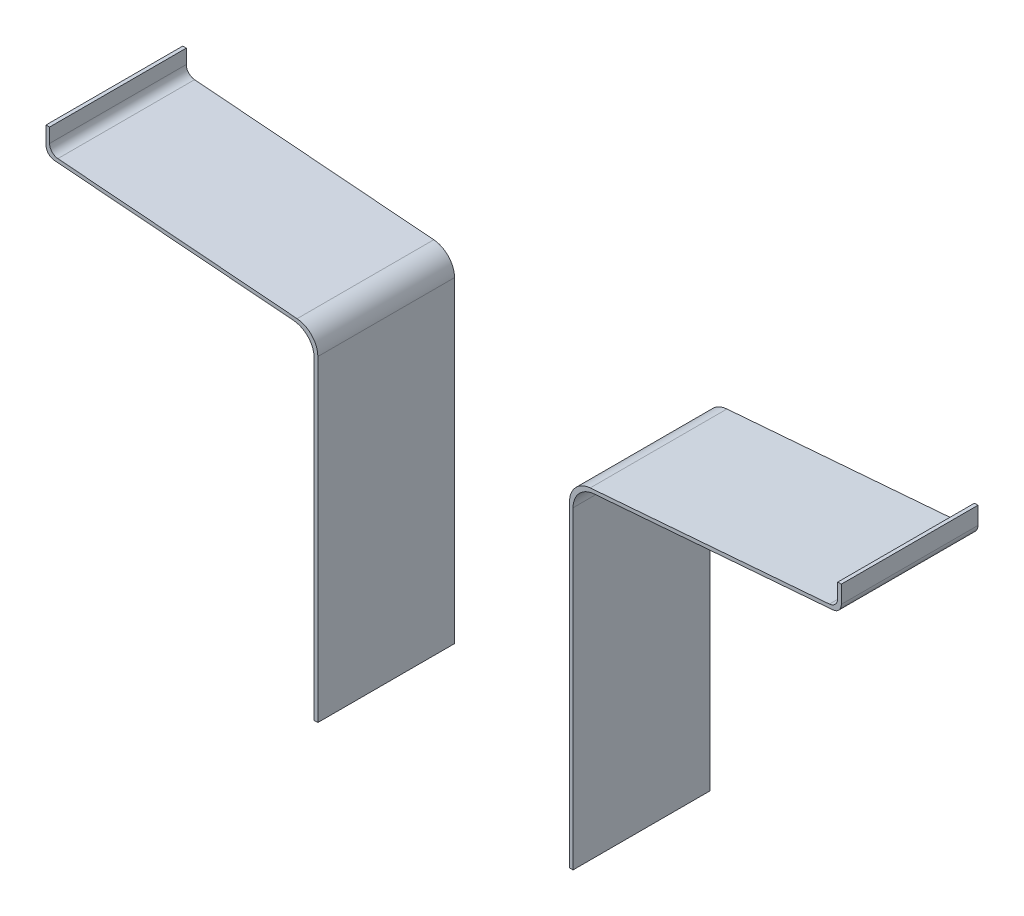
ISO-10303-21;
HEADER;
FILE_DESCRIPTION(('STEP AP214'),'2;1');
FILE_NAME('part.step','',(''),(''),'','','');
FILE_SCHEMA(('AUTOMOTIVE_DESIGN { 1 0 10303 214 1 1 1 1 }'));
ENDSEC;
DATA;
#1=APPLICATION_CONTEXT('core data for automotive mechanical design processes');
#2=APPLICATION_PROTOCOL_DEFINITION('international standard','automotive_design',2000,#1);
#3=PRODUCT_CONTEXT('',#1,'mechanical');
#4=PRODUCT('Part','Part','',(#3));
#5=PRODUCT_RELATED_PRODUCT_CATEGORY('part','',(#4));
#6=PRODUCT_DEFINITION_FORMATION('','',#4);
#7=PRODUCT_DEFINITION_CONTEXT('part definition',#1,'design');
#8=PRODUCT_DEFINITION('design','',#6,#7);
#9=PRODUCT_DEFINITION_SHAPE('','',#8);
#10=(LENGTH_UNIT() NAMED_UNIT(*) SI_UNIT(.MILLI.,.METRE.));
#11=(NAMED_UNIT(*) PLANE_ANGLE_UNIT() SI_UNIT($,.RADIAN.));
#12=(NAMED_UNIT(*) SI_UNIT($,.STERADIAN.) SOLID_ANGLE_UNIT());
#13=UNCERTAINTY_MEASURE_WITH_UNIT(LENGTH_MEASURE(1.E-05),#10,'distance_accuracy_value','');
#14=(GEOMETRIC_REPRESENTATION_CONTEXT(3) GLOBAL_UNCERTAINTY_ASSIGNED_CONTEXT((#13)) GLOBAL_UNIT_ASSIGNED_CONTEXT((#10,
#11,#12)) REPRESENTATION_CONTEXT('',''));
#15=CARTESIAN_POINT('',(0.,0.,0.));
#16=DIRECTION('',(0.,0.,1.));
#17=DIRECTION('',(1.,0.,0.));
#18=AXIS2_PLACEMENT_3D('',#15,#16,#17);
#19=CARTESIAN_POINT('',(350.,0.,60.7));
#20=DIRECTION('',(1.,0.,0.));
#21=DIRECTION('',(0.,0.,-1.));
#22=AXIS2_PLACEMENT_3D('',#19,#20,#21);
#23=PLANE('',#22);
#24=DIRECTION('',(0.,-1.,0.));
#25=VECTOR('',#24,1.);
#26=CARTESIAN_POINT('',(350.,0.,0.));
#27=LINE('',#26,#25);
#28=CARTESIAN_POINT('',(350.,0.,0.));
#29=VERTEX_POINT('',#28);
#30=CARTESIAN_POINT('',(350.,-6.30534185427882,0.));
#31=VERTEX_POINT('',#30);
#32=EDGE_CURVE('E171',#29,#31,#27,.T.);
#33=ORIENTED_EDGE('',*,*,#32,.T.);
#34=DIRECTION('',(0.,0.,-1.));
#35=VECTOR('',#34,1.);
#36=CARTESIAN_POINT('',(350.,-6.30534185427882,60.7));
#37=LINE('',#36,#35);
#38=CARTESIAN_POINT('',(350.,-6.30534185427882,60.7));
#39=VERTEX_POINT('',#38);
#40=EDGE_CURVE('E215',#31,#39,#37,.F.);
#41=ORIENTED_EDGE('',*,*,#40,.T.);
#42=DIRECTION('',(0.,-1.,0.));
#43=VECTOR('',#42,1.);
#44=CARTESIAN_POINT('',(350.,0.,60.7));
#45=LINE('',#44,#43);
#46=CARTESIAN_POINT('',(350.,0.,60.7));
#47=VERTEX_POINT('',#46);
#48=EDGE_CURVE('E188',#47,#39,#45,.T.);
#49=ORIENTED_EDGE('',*,*,#48,.F.);
#50=DIRECTION('',(0.,0.,-1.));
#51=VECTOR('',#50,1.);
#52=CARTESIAN_POINT('',(350.,0.,60.7));
#53=LINE('',#52,#51);
#54=EDGE_CURVE('E170',#47,#29,#53,.T.);
#55=ORIENTED_EDGE('',*,*,#54,.T.);
#56=EDGE_LOOP('',(#33,#41,#49,#55));
#57=FACE_BOUND('',#56,.T.);
#58=ADVANCED_FACE('F43',(#57),#23,.F.);
#59=CARTESIAN_POINT('',(350.,-10.,60.7));
#60=DIRECTION('',(0.0792398536366962,-0.99685557910644,0.));
#61=DIRECTION('',(0.99685557910644,0.0792398536366962,0.));
#62=AXIS2_PLACEMENT_3D('',#59,#60,#61);
#63=PLANE('',#62);
#64=DIRECTION('',(-0.99685557910644,-0.0792398536366962,0.));
#65=VECTOR('',#64,1.);
#66=CARTESIAN_POINT('',(350.,-10.,60.7));
#67=LINE('',#66,#65);
#68=CARTESIAN_POINT('',(346.316959414547,-10.2927641707046,60.7));
#69=VERTEX_POINT('',#68);
#70=CARTESIAN_POINT('',(240.087601463633,-18.7369149106703,60.7));
#71=VERTEX_POINT('',#70);
#72=EDGE_CURVE('E144',#69,#71,#67,.T.);
#73=ORIENTED_EDGE('',*,*,#72,.F.);
#74=DIRECTION('',(0.,0.,-1.));
#75=VECTOR('',#74,1.);
#76=CARTESIAN_POINT('',(346.316959414547,-10.2927641707046,0.));
#77=LINE('',#76,#75);
#78=CARTESIAN_POINT('',(346.316959414547,-10.2927641707046,0.));
#79=VERTEX_POINT('',#78);
#80=EDGE_CURVE('E212',#69,#79,#77,.T.);
#81=ORIENTED_EDGE('',*,*,#80,.T.);
#82=DIRECTION('',(-0.99685557910644,-0.0792398536366962,0.));
#83=VECTOR('',#82,1.);
#84=CARTESIAN_POINT('',(350.,-10.,0.));
#85=LINE('',#84,#83);
#86=CARTESIAN_POINT('',(240.087601463633,-18.7369149106703,0.));
#87=VERTEX_POINT('',#86);
#88=EDGE_CURVE('E174',#79,#87,#85,.T.);
#89=ORIENTED_EDGE('',*,*,#88,.T.);
#90=DIRECTION('',(0.,0.,-1.));
#91=VECTOR('',#90,1.);
#92=CARTESIAN_POINT('',(240.087601463633,-18.7369149106703,60.7));
#93=LINE('',#92,#91);
#94=EDGE_CURVE('E196',#87,#71,#93,.F.);
#95=ORIENTED_EDGE('',*,*,#94,.T.);
#96=EDGE_LOOP('',(#73,#81,#89,#95));
#97=FACE_BOUND('',#96,.T.);
#98=ADVANCED_FACE('F238',(#97),#63,.F.);
#99=CARTESIAN_POINT('',(230.88,-19.4688253374317,60.7));
#100=DIRECTION('',(1.,0.,0.));
#101=DIRECTION('',(0.,1.,0.));
#102=AXIS2_PLACEMENT_3D('',#99,#100,#101);
#103=PLANE('',#102);
#104=DIRECTION('',(0.,-1.,0.));
#105=VECTOR('',#104,1.);
#106=CARTESIAN_POINT('',(230.88,-19.4688253374317,60.7));
#107=LINE('',#106,#105);
#108=CARTESIAN_POINT('',(230.88,-28.7054707017347,60.7));
#109=VERTEX_POINT('',#108);
#110=CARTESIAN_POINT('',(230.88,-169.468825337432,60.7));
#111=VERTEX_POINT('',#110);
#112=EDGE_CURVE('E132',#109,#111,#107,.T.);
#113=ORIENTED_EDGE('',*,*,#112,.F.);
#114=DIRECTION('',(0.,0.,-1.));
#115=VECTOR('',#114,1.);
#116=CARTESIAN_POINT('',(230.88,-28.7054707017347,60.7));
#117=LINE('',#116,#115);
#118=CARTESIAN_POINT('',(230.88,-28.7054707017347,0.));
#119=VERTEX_POINT('',#118);
#120=EDGE_CURVE('E153',#109,#119,#117,.T.);
#121=ORIENTED_EDGE('',*,*,#120,.T.);
#122=DIRECTION('',(0.,-1.,0.));
#123=VECTOR('',#122,1.);
#124=CARTESIAN_POINT('',(230.88,-19.4688253374317,0.));
#125=LINE('',#124,#123);
#126=CARTESIAN_POINT('',(230.88,-169.468825337432,0.));
#127=VERTEX_POINT('',#126);
#128=EDGE_CURVE('E150',#119,#127,#125,.T.);
#129=ORIENTED_EDGE('',*,*,#128,.T.);
#130=DIRECTION('',(0.,0.,-1.));
#131=VECTOR('',#130,1.);
#132=CARTESIAN_POINT('',(230.88,-169.468825337432,60.7));
#133=LINE('',#132,#131);
#134=EDGE_CURVE('E147',#111,#127,#133,.T.);
#135=ORIENTED_EDGE('',*,*,#134,.F.);
#136=EDGE_LOOP('',(#113,#121,#129,#135));
#137=FACE_BOUND('',#136,.T.);
#138=ADVANCED_FACE('F148',(#137),#103,.F.);
#139=CARTESIAN_POINT('',(230.88,-169.468825337432,60.7));
#140=DIRECTION('',(0.,1.,0.));
#141=DIRECTION('',(0.,0.,1.));
#142=AXIS2_PLACEMENT_3D('',#139,#140,#141);
#143=PLANE('',#142);
#144=DIRECTION('',(1.,0.,0.));
#145=VECTOR('',#144,1.);
#146=CARTESIAN_POINT('',(230.88,-169.468825337432,0.));
#147=LINE('',#146,#145);
#148=CARTESIAN_POINT('',(232.47,-169.468825337432,0.));
#149=VERTEX_POINT('',#148);
#150=EDGE_CURVE('E177',#127,#149,#147,.T.);
#151=ORIENTED_EDGE('',*,*,#150,.T.);
#152=DIRECTION('',(0.,0.,-1.));
#153=VECTOR('',#152,1.);
#154=CARTESIAN_POINT('',(232.47,-169.468825337432,60.7));
#155=LINE('',#154,#153);
#156=CARTESIAN_POINT('',(232.47,-169.468825337432,60.7));
#157=VERTEX_POINT('',#156);
#158=EDGE_CURVE('E154',#157,#149,#155,.T.);
#159=ORIENTED_EDGE('',*,*,#158,.F.);
#160=DIRECTION('',(1.,0.,0.));
#161=VECTOR('',#160,1.);
#162=CARTESIAN_POINT('',(230.88,-169.468825337432,60.7));
#163=LINE('',#162,#161);
#164=EDGE_CURVE('E137',#111,#157,#163,.T.);
#165=ORIENTED_EDGE('',*,*,#164,.F.);
#166=ORIENTED_EDGE('',*,*,#134,.T.);
#167=EDGE_LOOP('',(#151,#159,#165,#166));
#168=FACE_BOUND('',#167,.T.);
#169=ADVANCED_FACE('F156',(#168),#143,.F.);
#170=CARTESIAN_POINT('',(232.47,-169.468825337432,60.7));
#171=DIRECTION('',(-1.,0.,0.));
#172=DIRECTION('',(0.,-1.,0.));
#173=AXIS2_PLACEMENT_3D('',#170,#171,#172);
#174=PLANE('',#173);
#175=DIRECTION('',(0.,1.,0.));
#176=VECTOR('',#175,1.);
#177=CARTESIAN_POINT('',(232.47,-169.468825337432,0.));
#178=LINE('',#177,#176);
#179=CARTESIAN_POINT('',(232.47,-30.1740973146589,0.));
#180=VERTEX_POINT('',#179);
#181=EDGE_CURVE('E179',#149,#180,#178,.T.);
#182=ORIENTED_EDGE('',*,*,#181,.T.);
#183=DIRECTION('',(0.,0.,-1.));
#184=VECTOR('',#183,1.);
#185=CARTESIAN_POINT('',(232.47,-30.1740973146589,60.7));
#186=LINE('',#185,#184);
#187=CARTESIAN_POINT('',(232.47,-30.1740973146589,60.7));
#188=VERTEX_POINT('',#187);
#189=EDGE_CURVE('E202',#180,#188,#186,.F.);
#190=ORIENTED_EDGE('',*,*,#189,.T.);
#191=DIRECTION('',(0.,1.,0.));
#192=VECTOR('',#191,1.);
#193=CARTESIAN_POINT('',(232.47,-169.468825337432,60.7));
#194=LINE('',#193,#192);
#195=EDGE_CURVE('E159',#157,#188,#194,.T.);
#196=ORIENTED_EDGE('',*,*,#195,.F.);
#197=ORIENTED_EDGE('',*,*,#158,.T.);
#198=EDGE_LOOP('',(#182,#190,#196,#197));
#199=FACE_BOUND('',#198,.T.);
#200=ADVANCED_FACE('F245',(#199),#174,.F.);
#201=CARTESIAN_POINT('',(232.47,-20.9374519503559,60.7));
#202=DIRECTION('',(-0.0792398536366963,0.99685557910644,0.));
#203=DIRECTION('',(-0.99685557910644,-0.0792398536366963,0.));
#204=AXIS2_PLACEMENT_3D('',#201,#202,#203);
#205=PLANE('',#204);
#206=DIRECTION('',(0.99685557910644,0.0792398536366963,0.));
#207=VECTOR('',#206,1.);
#208=CARTESIAN_POINT('',(232.47,-20.9374519503559,0.));
#209=LINE('',#208,#207);
#210=CARTESIAN_POINT('',(241.677601463633,-20.2055415235945,0.));
#211=VERTEX_POINT('',#210);
#212=CARTESIAN_POINT('',(347.904459414547,-11.7615895081363,0.));
#213=VERTEX_POINT('',#212);
#214=EDGE_CURVE('E182',#211,#213,#209,.T.);
#215=ORIENTED_EDGE('',*,*,#214,.T.);
#216=DIRECTION('',(0.,0.,-1.));
#217=VECTOR('',#216,1.);
#218=CARTESIAN_POINT('',(347.904459414547,-11.7615895081363,60.7));
#219=LINE('',#218,#217);
#220=CARTESIAN_POINT('',(347.904459414547,-11.7615895081363,60.7));
#221=VERTEX_POINT('',#220);
#222=EDGE_CURVE('E58',#213,#221,#219,.F.);
#223=ORIENTED_EDGE('',*,*,#222,.T.);
#224=DIRECTION('',(0.99685557910644,0.0792398536366963,0.));
#225=VECTOR('',#224,1.);
#226=CARTESIAN_POINT('',(232.47,-20.9374519503559,60.7));
#227=LINE('',#226,#225);
#228=CARTESIAN_POINT('',(241.677601463633,-20.2055415235945,60.7));
#229=VERTEX_POINT('',#228);
#230=EDGE_CURVE('E161',#229,#221,#227,.T.);
#231=ORIENTED_EDGE('',*,*,#230,.F.);
#232=DIRECTION('',(0.,0.,-1.));
#233=VECTOR('',#232,1.);
#234=CARTESIAN_POINT('',(241.677601463633,-20.2055415235945,0.));
#235=LINE('',#234,#233);
#236=EDGE_CURVE('E199',#229,#211,#235,.T.);
#237=ORIENTED_EDGE('',*,*,#236,.T.);
#238=EDGE_LOOP('',(#215,#223,#231,#237));
#239=FACE_BOUND('',#238,.T.);
#240=ADVANCED_FACE('F251',(#239),#205,.F.);
#241=CARTESIAN_POINT('',(351.5875,0.,60.7));
#242=DIRECTION('',(-1.,0.,0.));
#243=DIRECTION('',(0.,0.,1.));
#244=AXIS2_PLACEMENT_3D('',#241,#242,#243);
#245=PLANE('',#244);
#246=DIRECTION('',(0.,1.,0.));
#247=VECTOR('',#246,1.);
#248=CARTESIAN_POINT('',(351.5875,0.,60.7));
#249=LINE('',#248,#247);
#250=CARTESIAN_POINT('',(351.5875,-7.77416719171057,60.7));
#251=VERTEX_POINT('',#250);
#252=CARTESIAN_POINT('',(351.5875,0.,60.7));
#253=VERTEX_POINT('',#252);
#254=EDGE_CURVE('E166',#251,#253,#249,.T.);
#255=ORIENTED_EDGE('',*,*,#254,.F.);
#256=DIRECTION('',(0.,0.,-1.));
#257=VECTOR('',#256,1.);
#258=CARTESIAN_POINT('',(351.5875,-7.77416719171057,60.7));
#259=LINE('',#258,#257);
#260=CARTESIAN_POINT('',(351.5875,-7.77416719171057,0.));
#261=VERTEX_POINT('',#260);
#262=EDGE_CURVE('E217',#251,#261,#259,.T.);
#263=ORIENTED_EDGE('',*,*,#262,.T.);
#264=DIRECTION('',(0.,1.,0.));
#265=VECTOR('',#264,1.);
#266=CARTESIAN_POINT('',(351.5875,0.,0.));
#267=LINE('',#266,#265);
#268=CARTESIAN_POINT('',(351.5875,0.,0.));
#269=VERTEX_POINT('',#268);
#270=EDGE_CURVE('E184',#261,#269,#267,.T.);
#271=ORIENTED_EDGE('',*,*,#270,.T.);
#272=DIRECTION('',(0.,0.,-1.));
#273=VECTOR('',#272,1.);
#274=CARTESIAN_POINT('',(351.5875,0.,60.7));
#275=LINE('',#274,#273);
#276=EDGE_CURVE('E191',#253,#269,#275,.T.);
#277=ORIENTED_EDGE('',*,*,#276,.F.);
#278=EDGE_LOOP('',(#255,#263,#271,#277));
#279=FACE_BOUND('',#278,.T.);
#280=ADVANCED_FACE('F257',(#279),#245,.F.);
#281=CARTESIAN_POINT('',(350.,0.,60.7));
#282=DIRECTION('',(0.,-1.,0.));
#283=DIRECTION('',(0.,0.,-1.));
#284=AXIS2_PLACEMENT_3D('',#281,#282,#283);
#285=PLANE('',#284);
#286=DIRECTION('',(-1.,0.,0.));
#287=VECTOR('',#286,1.);
#288=CARTESIAN_POINT('',(350.,0.,0.));
#289=LINE('',#288,#287);
#290=EDGE_CURVE('E186',#269,#29,#289,.T.);
#291=ORIENTED_EDGE('',*,*,#290,.T.);
#292=ORIENTED_EDGE('',*,*,#54,.F.);
#293=DIRECTION('',(-1.,0.,0.));
#294=VECTOR('',#293,1.);
#295=CARTESIAN_POINT('',(350.,0.,60.7));
#296=LINE('',#295,#294);
#297=EDGE_CURVE('E168',#253,#47,#296,.T.);
#298=ORIENTED_EDGE('',*,*,#297,.F.);
#299=ORIENTED_EDGE('',*,*,#276,.T.);
#300=EDGE_LOOP('',(#291,#292,#298,#299));
#301=FACE_BOUND('',#300,.T.);
#302=ADVANCED_FACE('F260',(#301),#285,.F.);
#303=CARTESIAN_POINT('',(0.,0.,60.7));
#304=DIRECTION('',(0.,0.,1.));
#305=DIRECTION('',(1.,0.,0.));
#306=AXIS2_PLACEMENT_3D('',#303,#304,#305);
#307=PLANE('',#306);
#308=ORIENTED_EDGE('',*,*,#230,.T.);
#309=CARTESIAN_POINT('',(347.5875,-7.77416719171057,60.7));
#310=DIRECTION('',(0.,0.,1.));
#311=DIRECTION('',(1.,0.,0.));
#312=AXIS2_PLACEMENT_3D('',#309,#310,#311);
#313=CIRCLE('',#312,4.);
#314=EDGE_CURVE('E222',#221,#251,#313,.T.);
#315=ORIENTED_EDGE('',*,*,#314,.T.);
#316=ORIENTED_EDGE('',*,*,#254,.T.);
#317=ORIENTED_EDGE('',*,*,#297,.T.);
#318=ORIENTED_EDGE('',*,*,#48,.T.);
#319=CARTESIAN_POINT('',(346.,-6.30534185427882,60.7));
#320=DIRECTION('',(0.,0.,1.));
#321=DIRECTION('',(1.,0.,0.));
#322=AXIS2_PLACEMENT_3D('',#319,#320,#321);
#323=CIRCLE('',#322,4.);
#324=EDGE_CURVE('E12',#39,#69,#323,.F.);
#325=ORIENTED_EDGE('',*,*,#324,.T.);
#326=ORIENTED_EDGE('',*,*,#72,.T.);
#327=CARTESIAN_POINT('',(240.88,-28.7054707017347,60.7));
#328=DIRECTION('',(0.,0.,1.));
#329=DIRECTION('',(1.,0.,0.));
#330=AXIS2_PLACEMENT_3D('',#327,#328,#329);
#331=CIRCLE('',#330,10.);
#332=EDGE_CURVE('E140',#71,#109,#331,.T.);
#333=ORIENTED_EDGE('',*,*,#332,.T.);
#334=ORIENTED_EDGE('',*,*,#112,.T.);
#335=ORIENTED_EDGE('',*,*,#164,.T.);
#336=ORIENTED_EDGE('',*,*,#195,.T.);
#337=CARTESIAN_POINT('',(242.47,-30.1740973146589,60.7));
#338=DIRECTION('',(0.,0.,1.));
#339=DIRECTION('',(1.,0.,0.));
#340=AXIS2_PLACEMENT_3D('',#337,#338,#339);
#341=CIRCLE('',#340,10.);
#342=EDGE_CURVE('E206',#188,#229,#341,.F.);
#343=ORIENTED_EDGE('',*,*,#342,.T.);
#344=EDGE_LOOP('',(#308,#315,#316,#317,#318,#325,#326,#333,#334,#335,#336,#343));
#345=FACE_BOUND('',#344,.T.);
#346=ADVANCED_FACE('F134',(#345),#307,.T.);
#347=CARTESIAN_POINT('',(0.,0.,0.));
#348=DIRECTION('',(0.,0.,1.));
#349=DIRECTION('',(1.,0.,0.));
#350=AXIS2_PLACEMENT_3D('',#347,#348,#349);
#351=PLANE('',#350);
#352=ORIENTED_EDGE('',*,*,#270,.F.);
#353=CARTESIAN_POINT('',(347.5875,-7.77416719171057,0.));
#354=DIRECTION('',(0.,0.,1.));
#355=DIRECTION('',(1.,0.,0.));
#356=AXIS2_PLACEMENT_3D('',#353,#354,#355);
#357=CIRCLE('',#356,4.);
#358=EDGE_CURVE('E66',#261,#213,#357,.F.);
#359=ORIENTED_EDGE('',*,*,#358,.T.);
#360=ORIENTED_EDGE('',*,*,#214,.F.);
#361=CARTESIAN_POINT('',(242.47,-30.1740973146589,0.));
#362=DIRECTION('',(0.,0.,1.));
#363=DIRECTION('',(1.,0.,0.));
#364=AXIS2_PLACEMENT_3D('',#361,#362,#363);
#365=CIRCLE('',#364,10.);
#366=EDGE_CURVE('E204',#211,#180,#365,.T.);
#367=ORIENTED_EDGE('',*,*,#366,.T.);
#368=ORIENTED_EDGE('',*,*,#181,.F.);
#369=ORIENTED_EDGE('',*,*,#150,.F.);
#370=ORIENTED_EDGE('',*,*,#128,.F.);
#371=CARTESIAN_POINT('',(240.88,-28.7054707017347,0.));
#372=DIRECTION('',(0.,0.,1.));
#373=DIRECTION('',(1.,0.,0.));
#374=AXIS2_PLACEMENT_3D('',#371,#372,#373);
#375=CIRCLE('',#374,10.);
#376=EDGE_CURVE('E208',#119,#87,#375,.F.);
#377=ORIENTED_EDGE('',*,*,#376,.T.);
#378=ORIENTED_EDGE('',*,*,#88,.F.);
#379=CARTESIAN_POINT('',(346.,-6.30534185427882,0.));
#380=DIRECTION('',(0.,0.,1.));
#381=DIRECTION('',(1.,0.,0.));
#382=AXIS2_PLACEMENT_3D('',#379,#380,#381);
#383=CIRCLE('',#382,4.);
#384=EDGE_CURVE('E51',#79,#31,#383,.T.);
#385=ORIENTED_EDGE('',*,*,#384,.T.);
#386=ORIENTED_EDGE('',*,*,#32,.F.);
#387=ORIENTED_EDGE('',*,*,#290,.F.);
#388=EDGE_LOOP('',(#352,#359,#360,#367,#368,#369,#370,#377,#378,#385,#386,#387));
#389=FACE_BOUND('',#388,.T.);
#390=ADVANCED_FACE('F225',(#389),#351,.F.);
#391=CARTESIAN_POINT('',(240.88,-28.7054707017347,60.7));
#392=DIRECTION('',(0.,0.,-1.));
#393=DIRECTION('',(-1.,0.,0.));
#394=AXIS2_PLACEMENT_3D('',#391,#392,#393);
#395=CYLINDRICAL_SURFACE('',#394,10.);
#396=ORIENTED_EDGE('',*,*,#332,.F.);
#397=ORIENTED_EDGE('',*,*,#94,.F.);
#398=ORIENTED_EDGE('',*,*,#376,.F.);
#399=ORIENTED_EDGE('',*,*,#120,.F.);
#400=EDGE_LOOP('',(#396,#397,#398,#399));
#401=FACE_BOUND('',#400,.T.);
#402=ADVANCED_FACE('F242',(#401),#395,.T.);
#403=CARTESIAN_POINT('',(242.47,-30.1740973146589,60.7));
#404=DIRECTION('',(0.,0.,1.));
#405=DIRECTION('',(1.,0.,0.));
#406=AXIS2_PLACEMENT_3D('',#403,#404,#405);
#407=CYLINDRICAL_SURFACE('',#406,10.);
#408=ORIENTED_EDGE('',*,*,#342,.F.);
#409=ORIENTED_EDGE('',*,*,#189,.F.);
#410=ORIENTED_EDGE('',*,*,#366,.F.);
#411=ORIENTED_EDGE('',*,*,#236,.F.);
#412=EDGE_LOOP('',(#408,#409,#410,#411));
#413=FACE_BOUND('',#412,.T.);
#414=ADVANCED_FACE('F250',(#413),#407,.F.);
#415=CARTESIAN_POINT('',(346.,-6.30534185427882,60.7));
#416=DIRECTION('',(0.,0.,1.));
#417=DIRECTION('',(1.,0.,0.));
#418=AXIS2_PLACEMENT_3D('',#415,#416,#417);
#419=CYLINDRICAL_SURFACE('',#418,4.);
#420=ORIENTED_EDGE('',*,*,#324,.F.);
#421=ORIENTED_EDGE('',*,*,#40,.F.);
#422=ORIENTED_EDGE('',*,*,#384,.F.);
#423=ORIENTED_EDGE('',*,*,#80,.F.);
#424=EDGE_LOOP('',(#420,#421,#422,#423));
#425=FACE_BOUND('',#424,.T.);
#426=ADVANCED_FACE('F235',(#425),#419,.F.);
#427=CARTESIAN_POINT('',(347.5875,-7.77416719171057,60.7));
#428=DIRECTION('',(0.,0.,-1.));
#429=DIRECTION('',(-1.,0.,0.));
#430=AXIS2_PLACEMENT_3D('',#427,#428,#429);
#431=CYLINDRICAL_SURFACE('',#430,4.);
#432=ORIENTED_EDGE('',*,*,#314,.F.);
#433=ORIENTED_EDGE('',*,*,#222,.F.);
#434=ORIENTED_EDGE('',*,*,#358,.F.);
#435=ORIENTED_EDGE('',*,*,#262,.F.);
#436=EDGE_LOOP('',(#432,#433,#434,#435));
#437=FACE_BOUND('',#436,.T.);
#438=ADVANCED_FACE('F45',(#437),#431,.T.);
#439=CLOSED_SHELL('',(#58,#98,#138,#169,#200,#240,#280,#302,#346,#390,#402,#414,#426,#438));
#440=MANIFOLD_SOLID_BREP('B2',#439);
#441=CARTESIAN_POINT('',(0.,0.,60.7));
#442=DIRECTION('',(-1.,0.,0.));
#443=DIRECTION('',(0.,0.,1.));
#444=AXIS2_PLACEMENT_3D('',#441,#442,#443);
#445=PLANE('',#444);
#446=DIRECTION('',(0.,1.,0.));
#447=VECTOR('',#446,1.);
#448=CARTESIAN_POINT('',(0.,0.,60.7));
#449=LINE('',#448,#447);
#450=CARTESIAN_POINT('',(0.,-6.30534185427882,60.7));
#451=VERTEX_POINT('',#450);
#452=CARTESIAN_POINT('',(0.,0.,60.7));
#453=VERTEX_POINT('',#452);
#454=EDGE_CURVE('E461',#451,#453,#449,.T.);
#455=ORIENTED_EDGE('',*,*,#454,.F.);
#456=DIRECTION('',(0.,0.,-1.));
#457=VECTOR('',#456,1.);
#458=CARTESIAN_POINT('',(0.,-6.30534185427882,0.));
#459=LINE('',#458,#457);
#460=CARTESIAN_POINT('',(0.,-6.30534185427882,0.));
#461=VERTEX_POINT('',#460);
#462=EDGE_CURVE('E519',#451,#461,#459,.T.);
#463=ORIENTED_EDGE('',*,*,#462,.T.);
#464=DIRECTION('',(0.,1.,0.));
#465=VECTOR('',#464,1.);
#466=CARTESIAN_POINT('',(0.,0.,0.));
#467=LINE('',#466,#465);
#468=CARTESIAN_POINT('',(0.,0.,0.));
#469=VERTEX_POINT('',#468);
#470=EDGE_CURVE('E483',#461,#469,#467,.T.);
#471=ORIENTED_EDGE('',*,*,#470,.T.);
#472=DIRECTION('',(0.,0.,-1.));
#473=VECTOR('',#472,1.);
#474=CARTESIAN_POINT('',(0.,0.,60.7));
#475=LINE('',#474,#473);
#476=EDGE_CURVE('E476',#453,#469,#475,.T.);
#477=ORIENTED_EDGE('',*,*,#476,.F.);
#478=EDGE_LOOP('',(#455,#463,#471,#477));
#479=FACE_BOUND('',#478,.T.);
#480=ADVANCED_FACE('F375',(#479),#445,.F.);
#481=CARTESIAN_POINT('',(0.,0.,60.7));
#482=DIRECTION('',(0.,-1.,0.));
#483=DIRECTION('',(0.,0.,-1.));
#484=AXIS2_PLACEMENT_3D('',#481,#482,#483);
#485=PLANE('',#484);
#486=DIRECTION('',(-1.,0.,0.));
#487=VECTOR('',#486,1.);
#488=CARTESIAN_POINT('',(0.,0.,0.));
#489=LINE('',#488,#487);
#490=CARTESIAN_POINT('',(-1.58750000000002,0.,0.));
#491=VERTEX_POINT('',#490);
#492=EDGE_CURVE('E580',#469,#491,#489,.T.);
#493=ORIENTED_EDGE('',*,*,#492,.T.);
#494=DIRECTION('',(0.,0.,-1.));
#495=VECTOR('',#494,1.);
#496=CARTESIAN_POINT('',(-1.58750000000002,0.,60.7));
#497=LINE('',#496,#495);
#498=CARTESIAN_POINT('',(-1.58750000000002,0.,60.7));
#499=VERTEX_POINT('',#498);
#500=EDGE_CURVE('E478',#499,#491,#497,.T.);
#501=ORIENTED_EDGE('',*,*,#500,.F.);
#502=DIRECTION('',(-1.,0.,0.));
#503=VECTOR('',#502,1.);
#504=CARTESIAN_POINT('',(0.,0.,60.7));
#505=LINE('',#504,#503);
#506=EDGE_CURVE('E465',#453,#499,#505,.T.);
#507=ORIENTED_EDGE('',*,*,#506,.F.);
#508=ORIENTED_EDGE('',*,*,#476,.T.);
#509=EDGE_LOOP('',(#493,#501,#507,#508));
#510=FACE_BOUND('',#509,.T.);
#511=ADVANCED_FACE('F475',(#510),#485,.F.);
#512=CARTESIAN_POINT('',(-1.58750000000002,0.,60.7));
#513=DIRECTION('',(1.,0.,0.));
#514=DIRECTION('',(0.,1.,0.));
#515=AXIS2_PLACEMENT_3D('',#512,#513,#514);
#516=PLANE('',#515);
#517=DIRECTION('',(0.,-1.,0.));
#518=VECTOR('',#517,1.);
#519=CARTESIAN_POINT('',(-1.58750000000002,0.,0.));
#520=LINE('',#519,#518);
#521=CARTESIAN_POINT('',(-1.58750000000002,-7.77416719171057,0.));
#522=VERTEX_POINT('',#521);
#523=EDGE_CURVE('E582',#491,#522,#520,.T.);
#524=ORIENTED_EDGE('',*,*,#523,.T.);
#525=DIRECTION('',(0.,0.,-1.));
#526=VECTOR('',#525,1.);
#527=CARTESIAN_POINT('',(-1.58750000000002,-7.77416719171057,60.7));
#528=LINE('',#527,#526);
#529=CARTESIAN_POINT('',(-1.58750000000002,-7.77416719171057,60.7));
#530=VERTEX_POINT('',#529);
#531=EDGE_CURVE('E515',#522,#530,#528,.F.);
#532=ORIENTED_EDGE('',*,*,#531,.T.);
#533=DIRECTION('',(0.,-1.,0.));
#534=VECTOR('',#533,1.);
#535=CARTESIAN_POINT('',(-1.58750000000002,0.,60.7));
#536=LINE('',#535,#534);
#537=EDGE_CURVE('E480',#499,#530,#536,.T.);
#538=ORIENTED_EDGE('',*,*,#537,.F.);
#539=ORIENTED_EDGE('',*,*,#500,.T.);
#540=EDGE_LOOP('',(#524,#532,#538,#539));
#541=FACE_BOUND('',#540,.T.);
#542=ADVANCED_FACE('F542',(#541),#516,.F.);
#543=CARTESIAN_POINT('',(117.53,-20.9374519503559,60.7));
#544=DIRECTION('',(0.0792398536366963,0.99685557910644,0.));
#545=DIRECTION('',(-0.99685557910644,0.0792398536366963,0.));
#546=AXIS2_PLACEMENT_3D('',#543,#544,#545);
#547=PLANE('',#546);
#548=DIRECTION('',(0.99685557910644,-0.0792398536366963,0.));
#549=VECTOR('',#548,1.);
#550=CARTESIAN_POINT('',(117.53,-20.9374519503559,60.7));
#551=LINE('',#550,#549);
#552=CARTESIAN_POINT('',(2.09554058545321,-11.7615895081363,60.7));
#553=VERTEX_POINT('',#552);
#554=CARTESIAN_POINT('',(108.322398536367,-20.2055415235945,60.7));
#555=VERTEX_POINT('',#554);
#556=EDGE_CURVE('E561',#553,#555,#551,.T.);
#557=ORIENTED_EDGE('',*,*,#556,.F.);
#558=DIRECTION('',(0.,0.,-1.));
#559=VECTOR('',#558,1.);
#560=CARTESIAN_POINT('',(2.09554058545321,-11.7615895081363,60.7));
#561=LINE('',#560,#559);
#562=CARTESIAN_POINT('',(2.09554058545321,-11.7615895081363,0.));
#563=VERTEX_POINT('',#562);
#564=EDGE_CURVE('E510',#553,#563,#561,.T.);
#565=ORIENTED_EDGE('',*,*,#564,.T.);
#566=DIRECTION('',(0.99685557910644,-0.0792398536366963,0.));
#567=VECTOR('',#566,1.);
#568=CARTESIAN_POINT('',(117.53,-20.9374519503559,0.));
#569=LINE('',#568,#567);
#570=CARTESIAN_POINT('',(108.322398536367,-20.2055415235945,0.));
#571=VERTEX_POINT('',#570);
#572=EDGE_CURVE('E585',#563,#571,#569,.T.);
#573=ORIENTED_EDGE('',*,*,#572,.T.);
#574=DIRECTION('',(0.,0.,-1.));
#575=VECTOR('',#574,1.);
#576=CARTESIAN_POINT('',(108.322398536367,-20.2055415235945,60.7));
#577=LINE('',#576,#575);
#578=EDGE_CURVE('E498',#571,#555,#577,.F.);
#579=ORIENTED_EDGE('',*,*,#578,.T.);
#580=EDGE_LOOP('',(#557,#565,#573,#579));
#581=FACE_BOUND('',#580,.T.);
#582=ADVANCED_FACE('F616',(#581),#547,.F.);
#583=CARTESIAN_POINT('',(117.53,-169.468825337432,60.7));
#584=DIRECTION('',(1.,0.,0.));
#585=DIRECTION('',(0.,1.,0.));
#586=AXIS2_PLACEMENT_3D('',#583,#584,#585);
#587=PLANE('',#586);
#588=DIRECTION('',(0.,-1.,0.));
#589=VECTOR('',#588,1.);
#590=CARTESIAN_POINT('',(117.53,-169.468825337432,60.7));
#591=LINE('',#590,#589);
#592=CARTESIAN_POINT('',(117.53,-30.1740973146589,60.7));
#593=VERTEX_POINT('',#592);
#594=CARTESIAN_POINT('',(117.53,-169.468825337432,60.7));
#595=VERTEX_POINT('',#594);
#596=EDGE_CURVE('E558',#593,#595,#591,.T.);
#597=ORIENTED_EDGE('',*,*,#596,.F.);
#598=DIRECTION('',(0.,0.,-1.));
#599=VECTOR('',#598,1.);
#600=CARTESIAN_POINT('',(117.53,-30.1740973146589,0.));
#601=LINE('',#600,#599);
#602=CARTESIAN_POINT('',(117.53,-30.1740973146589,0.));
#603=VERTEX_POINT('',#602);
#604=EDGE_CURVE('E495',#593,#603,#601,.T.);
#605=ORIENTED_EDGE('',*,*,#604,.T.);
#606=DIRECTION('',(0.,-1.,0.));
#607=VECTOR('',#606,1.);
#608=CARTESIAN_POINT('',(117.53,-169.468825337432,0.));
#609=LINE('',#608,#607);
#610=CARTESIAN_POINT('',(117.53,-169.468825337432,0.));
#611=VERTEX_POINT('',#610);
#612=EDGE_CURVE('E587',#603,#611,#609,.T.);
#613=ORIENTED_EDGE('',*,*,#612,.T.);
#614=DIRECTION('',(0.,0.,-1.));
#615=VECTOR('',#614,1.);
#616=CARTESIAN_POINT('',(117.53,-169.468825337432,60.7));
#617=LINE('',#616,#615);
#618=EDGE_CURVE('E490',#595,#611,#617,.T.);
#619=ORIENTED_EDGE('',*,*,#618,.F.);
#620=EDGE_LOOP('',(#597,#605,#613,#619));
#621=FACE_BOUND('',#620,.T.);
#622=ADVANCED_FACE('F563',(#621),#587,.F.);
#623=CARTESIAN_POINT('',(119.12,-169.468825337432,60.7));
#624=DIRECTION('',(0.,1.,0.));
#625=DIRECTION('',(0.,0.,1.));
#626=AXIS2_PLACEMENT_3D('',#623,#624,#625);
#627=PLANE('',#626);
#628=DIRECTION('',(1.,0.,0.));
#629=VECTOR('',#628,1.);
#630=CARTESIAN_POINT('',(119.12,-169.468825337432,0.));
#631=LINE('',#630,#629);
#632=CARTESIAN_POINT('',(119.12,-169.468825337432,0.));
#633=VERTEX_POINT('',#632);
#634=EDGE_CURVE('E589',#611,#633,#631,.T.);
#635=ORIENTED_EDGE('',*,*,#634,.T.);
#636=DIRECTION('',(0.,0.,-1.));
#637=VECTOR('',#636,1.);
#638=CARTESIAN_POINT('',(119.12,-169.468825337432,60.7));
#639=LINE('',#638,#637);
#640=CARTESIAN_POINT('',(119.12,-169.468825337432,60.7));
#641=VERTEX_POINT('',#640);
#642=EDGE_CURVE('E578',#641,#633,#639,.T.);
#643=ORIENTED_EDGE('',*,*,#642,.F.);
#644=DIRECTION('',(1.,0.,0.));
#645=VECTOR('',#644,1.);
#646=CARTESIAN_POINT('',(119.12,-169.468825337432,60.7));
#647=LINE('',#646,#645);
#648=EDGE_CURVE('E567',#595,#641,#647,.T.);
#649=ORIENTED_EDGE('',*,*,#648,.F.);
#650=ORIENTED_EDGE('',*,*,#618,.T.);
#651=EDGE_LOOP('',(#635,#643,#649,#650));
#652=FACE_BOUND('',#651,.T.);
#653=ADVANCED_FACE('F596',(#652),#627,.F.);
#654=CARTESIAN_POINT('',(119.12,-19.4688253374317,60.7));
#655=DIRECTION('',(-1.,0.,0.));
#656=DIRECTION('',(0.,-1.,0.));
#657=AXIS2_PLACEMENT_3D('',#654,#655,#656);
#658=PLANE('',#657);
#659=DIRECTION('',(0.,1.,0.));
#660=VECTOR('',#659,1.);
#661=CARTESIAN_POINT('',(119.12,-19.4688253374317,0.));
#662=LINE('',#661,#660);
#663=CARTESIAN_POINT('',(119.12,-28.7054707017347,0.));
#664=VERTEX_POINT('',#663);
#665=EDGE_CURVE('E528',#633,#664,#662,.T.);
#666=ORIENTED_EDGE('',*,*,#665,.T.);
#667=DIRECTION('',(0.,0.,-1.));
#668=VECTOR('',#667,1.);
#669=CARTESIAN_POINT('',(119.12,-28.7054707017347,60.7));
#670=LINE('',#669,#668);
#671=CARTESIAN_POINT('',(119.12,-28.7054707017347,60.7));
#672=VERTEX_POINT('',#671);
#673=EDGE_CURVE('E488',#664,#672,#670,.F.);
#674=ORIENTED_EDGE('',*,*,#673,.T.);
#675=DIRECTION('',(0.,1.,0.));
#676=VECTOR('',#675,1.);
#677=CARTESIAN_POINT('',(119.12,-19.4688253374317,60.7));
#678=LINE('',#677,#676);
#679=EDGE_CURVE('E569',#641,#672,#678,.T.);
#680=ORIENTED_EDGE('',*,*,#679,.F.);
#681=ORIENTED_EDGE('',*,*,#642,.T.);
#682=EDGE_LOOP('',(#666,#674,#680,#681));
#683=FACE_BOUND('',#682,.T.);
#684=ADVANCED_FACE('F601',(#683),#658,.F.);
#685=CARTESIAN_POINT('',(0.,-10.,60.7));
#686=DIRECTION('',(-0.0792398536366962,-0.99685557910644,0.));
#687=DIRECTION('',(0.99685557910644,-0.0792398536366962,0.));
#688=AXIS2_PLACEMENT_3D('',#685,#686,#687);
#689=PLANE('',#688);
#690=DIRECTION('',(-0.99685557910644,0.0792398536366962,0.));
#691=VECTOR('',#690,1.);
#692=CARTESIAN_POINT('',(0.,-10.,0.));
#693=LINE('',#692,#691);
#694=CARTESIAN_POINT('',(109.912398536367,-18.7369149106703,0.));
#695=VERTEX_POINT('',#694);
#696=CARTESIAN_POINT('',(3.68304058545321,-10.2927641707046,0.));
#697=VERTEX_POINT('',#696);
#698=EDGE_CURVE('E471',#695,#697,#693,.T.);
#699=ORIENTED_EDGE('',*,*,#698,.T.);
#700=DIRECTION('',(0.,0.,-1.));
#701=VECTOR('',#700,1.);
#702=CARTESIAN_POINT('',(3.68304058545322,-10.2927641707046,60.7));
#703=LINE('',#702,#701);
#704=CARTESIAN_POINT('',(3.68304058545321,-10.2927641707046,60.7));
#705=VERTEX_POINT('',#704);
#706=EDGE_CURVE('E396',#697,#705,#703,.F.);
#707=ORIENTED_EDGE('',*,*,#706,.T.);
#708=DIRECTION('',(-0.99685557910644,0.0792398536366962,0.));
#709=VECTOR('',#708,1.);
#710=CARTESIAN_POINT('',(0.,-10.,60.7));
#711=LINE('',#710,#709);
#712=CARTESIAN_POINT('',(109.912398536367,-18.7369149106703,60.7));
#713=VERTEX_POINT('',#712);
#714=EDGE_CURVE('E576',#713,#705,#711,.T.);
#715=ORIENTED_EDGE('',*,*,#714,.F.);
#716=DIRECTION('',(0.,0.,-1.));
#717=VECTOR('',#716,1.);
#718=CARTESIAN_POINT('',(109.912398536367,-18.7369149106703,60.7));
#719=LINE('',#718,#717);
#720=EDGE_CURVE('E485',#713,#695,#719,.T.);
#721=ORIENTED_EDGE('',*,*,#720,.T.);
#722=EDGE_LOOP('',(#699,#707,#715,#721));
#723=FACE_BOUND('',#722,.T.);
#724=ADVANCED_FACE('F526',(#723),#689,.F.);
#725=CARTESIAN_POINT('',(0.,0.,60.7));
#726=DIRECTION('',(0.,0.,-1.));
#727=DIRECTION('',(-1.,0.,0.));
#728=AXIS2_PLACEMENT_3D('',#725,#726,#727);
#729=PLANE('',#728);
#730=ORIENTED_EDGE('',*,*,#537,.T.);
#731=CARTESIAN_POINT('',(2.41249999999998,-7.77416719171057,60.7));
#732=DIRECTION('',(0.,0.,-1.));
#733=DIRECTION('',(-1.,0.,0.));
#734=AXIS2_PLACEMENT_3D('',#731,#732,#733);
#735=CIRCLE('',#734,4.);
#736=EDGE_CURVE('E517',#530,#553,#735,.F.);
#737=ORIENTED_EDGE('',*,*,#736,.T.);
#738=ORIENTED_EDGE('',*,*,#556,.T.);
#739=CARTESIAN_POINT('',(107.53,-30.1740973146589,60.7));
#740=DIRECTION('',(0.,0.,-1.));
#741=DIRECTION('',(-1.,0.,0.));
#742=AXIS2_PLACEMENT_3D('',#739,#740,#741);
#743=CIRCLE('',#742,10.);
#744=EDGE_CURVE('E504',#555,#593,#743,.T.);
#745=ORIENTED_EDGE('',*,*,#744,.T.);
#746=ORIENTED_EDGE('',*,*,#596,.T.);
#747=ORIENTED_EDGE('',*,*,#648,.T.);
#748=ORIENTED_EDGE('',*,*,#679,.T.);
#749=CARTESIAN_POINT('',(109.12,-28.7054707017347,60.7));
#750=DIRECTION('',(0.,0.,-1.));
#751=DIRECTION('',(-1.,0.,0.));
#752=AXIS2_PLACEMENT_3D('',#749,#750,#751);
#753=CIRCLE('',#752,10.);
#754=EDGE_CURVE('E508',#672,#713,#753,.F.);
#755=ORIENTED_EDGE('',*,*,#754,.T.);
#756=ORIENTED_EDGE('',*,*,#714,.T.);
#757=CARTESIAN_POINT('',(4.,-6.30534185427882,60.7));
#758=DIRECTION('',(0.,0.,-1.));
#759=DIRECTION('',(-1.,0.,0.));
#760=AXIS2_PLACEMENT_3D('',#757,#758,#759);
#761=CIRCLE('',#760,4.);
#762=EDGE_CURVE('E41',#705,#451,#761,.T.);
#763=ORIENTED_EDGE('',*,*,#762,.T.);
#764=ORIENTED_EDGE('',*,*,#454,.T.);
#765=ORIENTED_EDGE('',*,*,#506,.T.);
#766=EDGE_LOOP('',(#730,#737,#738,#745,#746,#747,#748,#755,#756,#763,#764,#765));
#767=FACE_BOUND('',#766,.T.);
#768=ADVANCED_FACE('F464',(#767),#729,.F.);
#769=CARTESIAN_POINT('',(0.,0.,0.));
#770=DIRECTION('',(0.,0.,-1.));
#771=DIRECTION('',(-1.,0.,0.));
#772=AXIS2_PLACEMENT_3D('',#769,#770,#771);
#773=PLANE('',#772);
#774=ORIENTED_EDGE('',*,*,#572,.F.);
#775=CARTESIAN_POINT('',(2.41249999999998,-7.77416719171057,0.));
#776=DIRECTION('',(0.,0.,-1.));
#777=DIRECTION('',(-1.,0.,0.));
#778=AXIS2_PLACEMENT_3D('',#775,#776,#777);
#779=CIRCLE('',#778,4.);
#780=EDGE_CURVE('E513',#563,#522,#779,.T.);
#781=ORIENTED_EDGE('',*,*,#780,.T.);
#782=ORIENTED_EDGE('',*,*,#523,.F.);
#783=ORIENTED_EDGE('',*,*,#492,.F.);
#784=ORIENTED_EDGE('',*,*,#470,.F.);
#785=CARTESIAN_POINT('',(4.,-6.30534185427882,0.));
#786=DIRECTION('',(0.,0.,-1.));
#787=DIRECTION('',(-1.,0.,0.));
#788=AXIS2_PLACEMENT_3D('',#785,#786,#787);
#789=CIRCLE('',#788,4.);
#790=EDGE_CURVE('E383',#461,#697,#789,.F.);
#791=ORIENTED_EDGE('',*,*,#790,.T.);
#792=ORIENTED_EDGE('',*,*,#698,.F.);
#793=CARTESIAN_POINT('',(109.12,-28.7054707017347,0.));
#794=DIRECTION('',(0.,0.,-1.));
#795=DIRECTION('',(-1.,0.,0.));
#796=AXIS2_PLACEMENT_3D('',#793,#794,#795);
#797=CIRCLE('',#796,10.);
#798=EDGE_CURVE('E506',#695,#664,#797,.T.);
#799=ORIENTED_EDGE('',*,*,#798,.T.);
#800=ORIENTED_EDGE('',*,*,#665,.F.);
#801=ORIENTED_EDGE('',*,*,#634,.F.);
#802=ORIENTED_EDGE('',*,*,#612,.F.);
#803=CARTESIAN_POINT('',(107.53,-30.1740973146589,0.));
#804=DIRECTION('',(0.,0.,-1.));
#805=DIRECTION('',(-1.,0.,0.));
#806=AXIS2_PLACEMENT_3D('',#803,#804,#805);
#807=CIRCLE('',#806,10.);
#808=EDGE_CURVE('E501',#603,#571,#807,.F.);
#809=ORIENTED_EDGE('',*,*,#808,.T.);
#810=EDGE_LOOP('',(#774,#781,#782,#783,#784,#791,#792,#799,#800,#801,#802,#809));
#811=FACE_BOUND('',#810,.T.);
#812=ADVANCED_FACE('F524',(#811),#773,.T.);
#813=CARTESIAN_POINT('',(109.12,-28.7054707017347,60.7));
#814=DIRECTION('',(0.,0.,-1.));
#815=DIRECTION('',(-1.,0.,0.));
#816=AXIS2_PLACEMENT_3D('',#813,#814,#815);
#817=CYLINDRICAL_SURFACE('',#816,10.);
#818=ORIENTED_EDGE('',*,*,#754,.F.);
#819=ORIENTED_EDGE('',*,*,#673,.F.);
#820=ORIENTED_EDGE('',*,*,#798,.F.);
#821=ORIENTED_EDGE('',*,*,#720,.F.);
#822=EDGE_LOOP('',(#818,#819,#820,#821));
#823=FACE_BOUND('',#822,.T.);
#824=ADVANCED_FACE('F546',(#823),#817,.T.);
#825=CARTESIAN_POINT('',(107.53,-30.1740973146589,60.7));
#826=DIRECTION('',(0.,0.,1.));
#827=DIRECTION('',(1.,0.,0.));
#828=AXIS2_PLACEMENT_3D('',#825,#826,#827);
#829=CYLINDRICAL_SURFACE('',#828,10.);
#830=ORIENTED_EDGE('',*,*,#744,.F.);
#831=ORIENTED_EDGE('',*,*,#578,.F.);
#832=ORIENTED_EDGE('',*,*,#808,.F.);
#833=ORIENTED_EDGE('',*,*,#604,.F.);
#834=EDGE_LOOP('',(#830,#831,#832,#833));
#835=FACE_BOUND('',#834,.T.);
#836=ADVANCED_FACE('F535',(#835),#829,.F.);
#837=CARTESIAN_POINT('',(2.41249999999998,-7.77416719171057,60.7));
#838=DIRECTION('',(0.,0.,-1.));
#839=DIRECTION('',(-1.,0.,0.));
#840=AXIS2_PLACEMENT_3D('',#837,#838,#839);
#841=CYLINDRICAL_SURFACE('',#840,4.);
#842=ORIENTED_EDGE('',*,*,#736,.F.);
#843=ORIENTED_EDGE('',*,*,#531,.F.);
#844=ORIENTED_EDGE('',*,*,#780,.F.);
#845=ORIENTED_EDGE('',*,*,#564,.F.);
#846=EDGE_LOOP('',(#842,#843,#844,#845));
#847=FACE_BOUND('',#846,.T.);
#848=ADVANCED_FACE('F531',(#847),#841,.T.);
#849=CARTESIAN_POINT('',(4.,-6.30534185427882,60.7));
#850=DIRECTION('',(0.,0.,1.));
#851=DIRECTION('',(1.,0.,0.));
#852=AXIS2_PLACEMENT_3D('',#849,#850,#851);
#853=CYLINDRICAL_SURFACE('',#852,4.);
#854=ORIENTED_EDGE('',*,*,#762,.F.);
#855=ORIENTED_EDGE('',*,*,#706,.F.);
#856=ORIENTED_EDGE('',*,*,#790,.F.);
#857=ORIENTED_EDGE('',*,*,#462,.F.);
#858=EDGE_LOOP('',(#854,#855,#856,#857));
#859=FACE_BOUND('',#858,.T.);
#860=ADVANCED_FACE('F377',(#859),#853,.F.);
#861=CLOSED_SHELL('',(#480,#511,#542,#582,#622,#653,#684,#724,#768,#812,#824,#836,#848,#860));
#862=MANIFOLD_SOLID_BREP('B6',#861);
#863=ADVANCED_BREP_SHAPE_REPRESENTATION('',(#18,#440,#862),#14);
#864=SHAPE_DEFINITION_REPRESENTATION(#9,#863);
ENDSEC;
END-ISO-10303-21;
